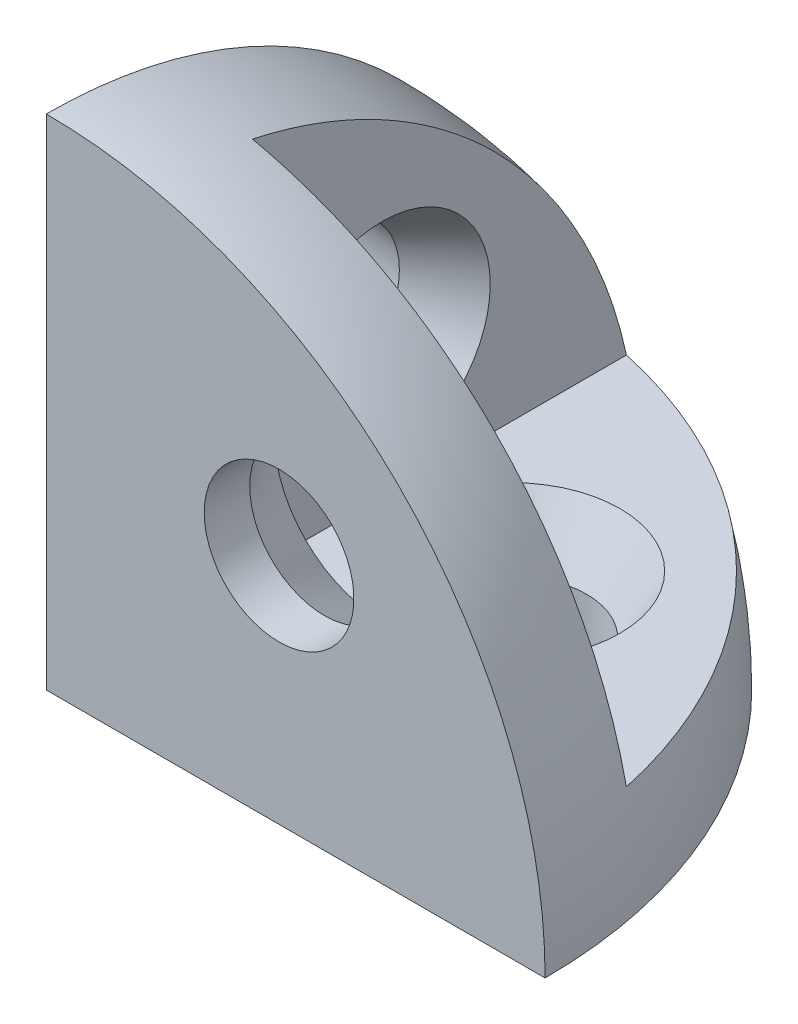
ISO-10303-21;
HEADER;
FILE_DESCRIPTION(('STEP AP214'),'2;1');
FILE_NAME('part.step','',(''),(''),'','','');
FILE_SCHEMA(('AUTOMOTIVE_DESIGN { 1 0 10303 214 1 1 1 1 }'));
ENDSEC;
DATA;
#1=APPLICATION_CONTEXT('core data for automotive mechanical design processes');
#2=APPLICATION_PROTOCOL_DEFINITION('international standard','automotive_design',2000,#1);
#3=PRODUCT_CONTEXT('',#1,'mechanical');
#4=PRODUCT('Part','Part','',(#3));
#5=PRODUCT_RELATED_PRODUCT_CATEGORY('part','',(#4));
#6=PRODUCT_DEFINITION_FORMATION('','',#4);
#7=PRODUCT_DEFINITION_CONTEXT('part definition',#1,'design');
#8=PRODUCT_DEFINITION('design','',#6,#7);
#9=PRODUCT_DEFINITION_SHAPE('','',#8);
#10=(LENGTH_UNIT() NAMED_UNIT(*) SI_UNIT(.MILLI.,.METRE.));
#11=(NAMED_UNIT(*) PLANE_ANGLE_UNIT() SI_UNIT($,.RADIAN.));
#12=(NAMED_UNIT(*) SI_UNIT($,.STERADIAN.) SOLID_ANGLE_UNIT());
#13=UNCERTAINTY_MEASURE_WITH_UNIT(LENGTH_MEASURE(1.E-05),#10,'distance_accuracy_value','');
#14=(GEOMETRIC_REPRESENTATION_CONTEXT(3) GLOBAL_UNCERTAINTY_ASSIGNED_CONTEXT((#13)) GLOBAL_UNIT_ASSIGNED_CONTEXT((#10,
#11,#12)) REPRESENTATION_CONTEXT('',''));
#15=CARTESIAN_POINT('',(0.,0.,0.));
#16=DIRECTION('',(0.,0.,1.));
#17=DIRECTION('',(1.,0.,0.));
#18=AXIS2_PLACEMENT_3D('',#15,#16,#17);
#19=CARTESIAN_POINT('',(-1.04744440165294E-13,0.,-30.));
#20=DIRECTION('',(0.,-1.,0.));
#21=DIRECTION('',(1.,0.,0.));
#22=AXIS2_PLACEMENT_3D('',#19,#20,#21);
#23=PLANE('',#22);
#24=CARTESIAN_POINT('',(14.,0.,-14.));
#25=DIRECTION('',(0.,1.,0.));
#26=DIRECTION('',(-1.,0.,0.));
#27=AXIS2_PLACEMENT_3D('',#24,#25,#26);
#28=CIRCLE('',#27,4.5);
#29=CARTESIAN_POINT('',(9.5,0.,-14.));
#30=VERTEX_POINT('',#29);
#31=EDGE_CURVE('E83',#30,#30,#28,.T.);
#32=ORIENTED_EDGE('',*,*,#31,.T.);
#33=EDGE_LOOP('',(#32));
#34=FACE_BOUND('',#33,.T.);
#35=CARTESIAN_POINT('',(0.,0.,0.));
#36=DIRECTION('',(0.,-1.,0.));
#37=DIRECTION('',(1.,0.,0.));
#38=AXIS2_PLACEMENT_3D('',#35,#36,#37);
#39=CIRCLE('',#38,30.);
#40=CARTESIAN_POINT('',(-1.04744440165294E-13,0.,-30.));
#41=VERTEX_POINT('',#40);
#42=CARTESIAN_POINT('',(30.,0.,0.));
#43=VERTEX_POINT('',#42);
#44=EDGE_CURVE('E111',#41,#43,#39,.T.);
#45=ORIENTED_EDGE('',*,*,#44,.T.);
#46=DIRECTION('',(1.,0.,0.));
#47=VECTOR('',#46,1.);
#48=CARTESIAN_POINT('',(30.,0.,0.));
#49=LINE('',#48,#47);
#50=CARTESIAN_POINT('',(0.,0.,0.));
#51=VERTEX_POINT('',#50);
#52=EDGE_CURVE('E98',#51,#43,#49,.T.);
#53=ORIENTED_EDGE('',*,*,#52,.F.);
#54=DIRECTION('',(0.,0.,-1.));
#55=VECTOR('',#54,1.);
#56=CARTESIAN_POINT('',(-1.04744440165294E-13,0.,-30.));
#57=LINE('',#56,#55);
#58=EDGE_CURVE('E105',#51,#41,#57,.T.);
#59=ORIENTED_EDGE('',*,*,#58,.T.);
#60=EDGE_LOOP('',(#45,#53,#59));
#61=FACE_BOUND('',#60,.T.);
#62=ADVANCED_FACE('F35',(#34,#61),#23,.T.);
#63=CARTESIAN_POINT('',(0.,0.,0.));
#64=DIRECTION('',(0.,-1.,0.));
#65=DIRECTION('',(0.,0.,-1.));
#66=AXIS2_PLACEMENT_3D('',#63,#64,#65);
#67=SPHERICAL_SURFACE('',#66,30.);
#68=CARTESIAN_POINT('',(6.2,0.,0.));
#69=DIRECTION('',(1.,0.,0.));
#70=DIRECTION('',(0.,0.,-1.));
#71=AXIS2_PLACEMENT_3D('',#68,#69,#70);
#72=CIRCLE('',#71,29.3523423256135);
#73=CARTESIAN_POINT('',(6.1999999999999,6.2,-28.6900679678526));
#74=VERTEX_POINT('',#73);
#75=CARTESIAN_POINT('',(6.19999999999998,28.6900679678526,-6.2));
#76=VERTEX_POINT('',#75);
#77=EDGE_CURVE('E90',#74,#76,#72,.T.);
#78=ORIENTED_EDGE('',*,*,#77,.F.);
#79=CARTESIAN_POINT('',(0.,6.2,0.));
#80=DIRECTION('',(0.,-1.,0.));
#81=DIRECTION('',(1.,0.,0.));
#82=AXIS2_PLACEMENT_3D('',#79,#80,#81);
#83=CIRCLE('',#82,29.3523423256135);
#84=CARTESIAN_POINT('',(28.6900679678526,6.2,-6.2));
#85=VERTEX_POINT('',#84);
#86=EDGE_CURVE('E93',#74,#85,#83,.T.);
#87=ORIENTED_EDGE('',*,*,#86,.T.);
#88=CARTESIAN_POINT('',(0.,0.,-6.2));
#89=DIRECTION('',(0.,0.,1.));
#90=DIRECTION('',(1.,0.,0.));
#91=AXIS2_PLACEMENT_3D('',#88,#89,#90);
#92=CIRCLE('',#91,29.3523423256135);
#93=EDGE_CURVE('E50',#85,#76,#92,.T.);
#94=ORIENTED_EDGE('',*,*,#93,.T.);
#95=EDGE_LOOP('',(#78,#87,#94));
#96=FACE_BOUND('',#95,.T.);
#97=CARTESIAN_POINT('',(0.,0.,0.));
#98=DIRECTION('',(1.,0.,0.));
#99=DIRECTION('',(0.,0.,-1.));
#100=AXIS2_PLACEMENT_3D('',#97,#98,#99);
#101=CIRCLE('',#100,30.);
#102=CARTESIAN_POINT('',(0.,30.,0.));
#103=VERTEX_POINT('',#102);
#104=EDGE_CURVE('E108',#41,#103,#101,.T.);
#105=ORIENTED_EDGE('',*,*,#104,.T.);
#106=CARTESIAN_POINT('',(0.,0.,0.));
#107=DIRECTION('',(0.,0.,1.));
#108=DIRECTION('',(1.,0.,0.));
#109=AXIS2_PLACEMENT_3D('',#106,#107,#108);
#110=CIRCLE('',#109,30.);
#111=EDGE_CURVE('E58',#43,#103,#110,.T.);
#112=ORIENTED_EDGE('',*,*,#111,.F.);
#113=ORIENTED_EDGE('',*,*,#44,.F.);
#114=EDGE_LOOP('',(#105,#112,#113));
#115=FACE_BOUND('',#114,.T.);
#116=ADVANCED_FACE('F140',(#96,#115),#67,.T.);
#117=CARTESIAN_POINT('',(0.,0.,0.));
#118=DIRECTION('',(1.,0.,0.));
#119=DIRECTION('',(0.,0.,-1.));
#120=AXIS2_PLACEMENT_3D('',#117,#118,#119);
#121=PLANE('',#120);
#122=CARTESIAN_POINT('',(-1.55257751099924E-13,14.,-14.));
#123=DIRECTION('',(1.,0.,0.));
#124=DIRECTION('',(0.,0.,-1.));
#125=AXIS2_PLACEMENT_3D('',#122,#123,#124);
#126=CIRCLE('',#125,4.5);
#127=CARTESIAN_POINT('',(-1.70969417124718E-13,14.,-18.5));
#128=VERTEX_POINT('',#127);
#129=EDGE_CURVE('E168',#128,#128,#126,.T.);
#130=ORIENTED_EDGE('',*,*,#129,.T.);
#131=EDGE_LOOP('',(#130));
#132=FACE_BOUND('',#131,.T.);
#133=DIRECTION('',(0.,-1.,0.));
#134=VECTOR('',#133,1.);
#135=CARTESIAN_POINT('',(0.,0.,0.));
#136=LINE('',#135,#134);
#137=EDGE_CURVE('E103',#103,#51,#136,.T.);
#138=ORIENTED_EDGE('',*,*,#137,.F.);
#139=ORIENTED_EDGE('',*,*,#104,.F.);
#140=ORIENTED_EDGE('',*,*,#58,.F.);
#141=EDGE_LOOP('',(#138,#139,#140));
#142=FACE_BOUND('',#141,.T.);
#143=ADVANCED_FACE('F147',(#132,#142),#121,.F.);
#144=CARTESIAN_POINT('',(0.,0.,0.));
#145=DIRECTION('',(0.,0.,1.));
#146=DIRECTION('',(1.,0.,0.));
#147=AXIS2_PLACEMENT_3D('',#144,#145,#146);
#148=PLANE('',#147);
#149=CARTESIAN_POINT('',(14.,14.,0.));
#150=DIRECTION('',(0.,0.,-1.));
#151=DIRECTION('',(-1.,0.,0.));
#152=AXIS2_PLACEMENT_3D('',#149,#150,#151);
#153=CIRCLE('',#152,4.5);
#154=CARTESIAN_POINT('',(9.5,14.,0.));
#155=VERTEX_POINT('',#154);
#156=EDGE_CURVE('E170',#155,#155,#153,.T.);
#157=ORIENTED_EDGE('',*,*,#156,.T.);
#158=EDGE_LOOP('',(#157));
#159=FACE_BOUND('',#158,.T.);
#160=ORIENTED_EDGE('',*,*,#137,.T.);
#161=ORIENTED_EDGE('',*,*,#52,.T.);
#162=ORIENTED_EDGE('',*,*,#111,.T.);
#163=EDGE_LOOP('',(#160,#161,#162));
#164=FACE_BOUND('',#163,.T.);
#165=ADVANCED_FACE('F191',(#159,#164),#148,.T.);
#166=CARTESIAN_POINT('',(-1.04364799657558E-13,6.2,-30.));
#167=DIRECTION('',(0.,-1.,0.));
#168=DIRECTION('',(1.,0.,0.));
#169=AXIS2_PLACEMENT_3D('',#166,#167,#168);
#170=PLANE('',#169);
#171=CARTESIAN_POINT('',(14.,6.2,-14.));
#172=DIRECTION('',(0.,-1.,0.));
#173=DIRECTION('',(1.,0.,0.));
#174=AXIS2_PLACEMENT_3D('',#171,#172,#173);
#175=CIRCLE('',#174,6.50000000000001);
#176=CARTESIAN_POINT('',(20.5,6.2,-14.));
#177=VERTEX_POINT('',#176);
#178=EDGE_CURVE('E122',#177,#177,#175,.T.);
#179=ORIENTED_EDGE('',*,*,#178,.T.);
#180=EDGE_LOOP('',(#179));
#181=FACE_BOUND('',#180,.T.);
#182=ORIENTED_EDGE('',*,*,#86,.F.);
#183=DIRECTION('',(0.,0.,-1.));
#184=VECTOR('',#183,1.);
#185=CARTESIAN_POINT('',(6.2,6.2,0.));
#186=LINE('',#185,#184);
#187=CARTESIAN_POINT('',(6.19999999999998,6.2,-6.2));
#188=VERTEX_POINT('',#187);
#189=EDGE_CURVE('E88',#188,#74,#186,.T.);
#190=ORIENTED_EDGE('',*,*,#189,.F.);
#191=DIRECTION('',(1.,0.,0.));
#192=VECTOR('',#191,1.);
#193=CARTESIAN_POINT('',(0.,6.2,-6.2));
#194=LINE('',#193,#192);
#195=EDGE_CURVE('E75',#188,#85,#194,.T.);
#196=ORIENTED_EDGE('',*,*,#195,.T.);
#197=EDGE_LOOP('',(#182,#190,#196));
#198=FACE_BOUND('',#197,.T.);
#199=ADVANCED_FACE('F92',(#181,#198),#170,.F.);
#200=CARTESIAN_POINT('',(6.2,0.,0.));
#201=DIRECTION('',(1.,0.,0.));
#202=DIRECTION('',(0.,0.,-1.));
#203=AXIS2_PLACEMENT_3D('',#200,#201,#202);
#204=PLANE('',#203);
#205=CARTESIAN_POINT('',(6.19999999999995,14.,-14.));
#206=DIRECTION('',(1.,0.,0.));
#207=DIRECTION('',(0.,0.,-1.));
#208=AXIS2_PLACEMENT_3D('',#205,#206,#207);
#209=CIRCLE('',#208,6.50000000000002);
#210=CARTESIAN_POINT('',(6.19999999999993,14.,-20.5));
#211=VERTEX_POINT('',#210);
#212=EDGE_CURVE('E116',#211,#211,#209,.F.);
#213=ORIENTED_EDGE('',*,*,#212,.T.);
#214=EDGE_LOOP('',(#213));
#215=FACE_BOUND('',#214,.T.);
#216=DIRECTION('',(0.,-1.,0.));
#217=VECTOR('',#216,1.);
#218=CARTESIAN_POINT('',(6.19999999999998,0.,-6.2));
#219=LINE('',#218,#217);
#220=EDGE_CURVE('E78',#76,#188,#219,.T.);
#221=ORIENTED_EDGE('',*,*,#220,.T.);
#222=ORIENTED_EDGE('',*,*,#189,.T.);
#223=ORIENTED_EDGE('',*,*,#77,.T.);
#224=EDGE_LOOP('',(#221,#222,#223));
#225=FACE_BOUND('',#224,.T.);
#226=ADVANCED_FACE('F87',(#215,#225),#204,.T.);
#227=CARTESIAN_POINT('',(0.,0.,-6.2));
#228=DIRECTION('',(0.,0.,1.));
#229=DIRECTION('',(1.,0.,0.));
#230=AXIS2_PLACEMENT_3D('',#227,#228,#229);
#231=PLANE('',#230);
#232=CARTESIAN_POINT('',(14.,14.,-6.2));
#233=DIRECTION('',(0.,0.,1.));
#234=DIRECTION('',(1.,0.,0.));
#235=AXIS2_PLACEMENT_3D('',#232,#233,#234);
#236=CIRCLE('',#235,6.50000000000004);
#237=CARTESIAN_POINT('',(7.49999999999996,14.,-6.2));
#238=VERTEX_POINT('',#237);
#239=EDGE_CURVE('E11',#238,#238,#236,.T.);
#240=ORIENTED_EDGE('',*,*,#239,.T.);
#241=EDGE_LOOP('',(#240));
#242=FACE_BOUND('',#241,.T.);
#243=ORIENTED_EDGE('',*,*,#220,.F.);
#244=ORIENTED_EDGE('',*,*,#93,.F.);
#245=ORIENTED_EDGE('',*,*,#195,.F.);
#246=EDGE_LOOP('',(#243,#244,#245));
#247=FACE_BOUND('',#246,.T.);
#248=ADVANCED_FACE('F77',(#242,#247),#231,.F.);
#249=CARTESIAN_POINT('',(14.,0.,-14.));
#250=DIRECTION('',(0.,1.,0.));
#251=DIRECTION('',(-1.,0.,0.));
#252=AXIS2_PLACEMENT_3D('',#249,#250,#251);
#253=CYLINDRICAL_SURFACE('',#252,4.5);
#254=CARTESIAN_POINT('',(14.,2.73589838486224,-14.));
#255=DIRECTION('',(0.,-1.,0.));
#256=DIRECTION('',(0.,0.,-1.));
#257=AXIS2_PLACEMENT_3D('',#254,#255,#256);
#258=CIRCLE('',#257,4.5);
#259=CARTESIAN_POINT('',(14.,2.73589838486224,-18.5));
#260=VERTEX_POINT('',#259);
#261=EDGE_CURVE('E119',#260,#260,#258,.F.);
#262=ORIENTED_EDGE('',*,*,#261,.T.);
#263=EDGE_LOOP('',(#262));
#264=FACE_BOUND('',#263,.T.);
#265=ORIENTED_EDGE('',*,*,#31,.F.);
#266=EDGE_LOOP('',(#265));
#267=FACE_BOUND('',#266,.T.);
#268=ADVANCED_FACE('F176',(#264,#267),#253,.F.);
#269=CARTESIAN_POINT('',(14.,14.,0.));
#270=DIRECTION('',(0.,0.,-1.));
#271=DIRECTION('',(-1.,0.,0.));
#272=AXIS2_PLACEMENT_3D('',#269,#270,#271);
#273=CYLINDRICAL_SURFACE('',#272,4.5);
#274=CARTESIAN_POINT('',(14.,14.,-2.73589838486217));
#275=DIRECTION('',(0.,0.,1.));
#276=DIRECTION('',(1.,0.,0.));
#277=AXIS2_PLACEMENT_3D('',#274,#275,#276);
#278=CIRCLE('',#277,4.5);
#279=CARTESIAN_POINT('',(9.5,14.,-2.73589838486217));
#280=VERTEX_POINT('',#279);
#281=EDGE_CURVE('E43',#280,#280,#278,.F.);
#282=CARTESIAN_POINT('',(9.5,14.,-2.73589838486217));
#283=CARTESIAN_POINT('',(9.5,14.,-2.70739944335319));
#284=CARTESIAN_POINT('',(9.5,14.,-2.67890050184421));
#285=CARTESIAN_POINT('',(9.5,14.,-2.62190261882625));
#286=CARTESIAN_POINT('',(9.5,14.,-2.59340367731727));
#287=CARTESIAN_POINT('',(9.5,14.,-2.53640579429931));
#288=CARTESIAN_POINT('',(9.5,14.,-2.50790685279033));
#289=CARTESIAN_POINT('',(9.5,14.,-2.45090896977236));
#290=CARTESIAN_POINT('',(9.5,14.,-2.42241002826338));
#291=CARTESIAN_POINT('',(9.5,14.,-2.36541214524542));
#292=CARTESIAN_POINT('',(9.5,14.,-2.33691320373644));
#293=CARTESIAN_POINT('',(9.5,14.,-2.27991532071848));
#294=CARTESIAN_POINT('',(9.5,14.,-2.2514163792095));
#295=CARTESIAN_POINT('',(9.5,14.,-2.19441849619154));
#296=CARTESIAN_POINT('',(9.5,14.,-2.16591955468255));
#297=CARTESIAN_POINT('',(9.5,14.,-2.10892167166459));
#298=CARTESIAN_POINT('',(9.5,14.,-2.08042273015561));
#299=CARTESIAN_POINT('',(9.5,14.,-2.02342484713765));
#300=CARTESIAN_POINT('',(9.5,14.,-1.99492590562867));
#301=CARTESIAN_POINT('',(9.5,14.,-1.93792802261071));
#302=CARTESIAN_POINT('',(9.5,14.,-1.90942908110173));
#303=CARTESIAN_POINT('',(9.5,14.,-1.85243119808376));
#304=CARTESIAN_POINT('',(9.5,14.,-1.82393225657478));
#305=CARTESIAN_POINT('',(9.5,14.,-1.76693437355682));
#306=CARTESIAN_POINT('',(9.5,14.,-1.73843543204784));
#307=CARTESIAN_POINT('',(9.5,14.,-1.68143754902988));
#308=CARTESIAN_POINT('',(9.5,14.,-1.6529386075209));
#309=CARTESIAN_POINT('',(9.5,14.,-1.59594072450293));
#310=CARTESIAN_POINT('',(9.5,14.,-1.56744178299395));
#311=CARTESIAN_POINT('',(9.5,14.,-1.51044389997599));
#312=CARTESIAN_POINT('',(9.5,14.,-1.48194495846701));
#313=CARTESIAN_POINT('',(9.5,14.,-1.42494707544905));
#314=CARTESIAN_POINT('',(9.5,14.,-1.39644813394007));
#315=CARTESIAN_POINT('',(9.5,14.,-1.33945025092211));
#316=CARTESIAN_POINT('',(9.5,14.,-1.31095130941313));
#317=CARTESIAN_POINT('',(9.5,14.,-1.25395342639516));
#318=CARTESIAN_POINT('',(9.5,14.,-1.22545448488618));
#319=CARTESIAN_POINT('',(9.5,14.,-1.16845660186822));
#320=CARTESIAN_POINT('',(9.5,14.,-1.13995766035924));
#321=CARTESIAN_POINT('',(9.5,14.,-1.08295977734128));
#322=CARTESIAN_POINT('',(9.5,14.,-1.0544608358323));
#323=CARTESIAN_POINT('',(9.5,14.,-0.997462952814335));
#324=CARTESIAN_POINT('',(9.5,14.,-0.968964011305353));
#325=CARTESIAN_POINT('',(9.5,14.,-0.911966128287392));
#326=CARTESIAN_POINT('',(9.5,14.,-0.88346718677841));
#327=CARTESIAN_POINT('',(9.5,14.,-0.826469303760448));
#328=CARTESIAN_POINT('',(9.5,14.,-0.797970362251468));
#329=CARTESIAN_POINT('',(9.5,14.,-0.740972479233506));
#330=CARTESIAN_POINT('',(9.5,14.,-0.712473537724524));
#331=CARTESIAN_POINT('',(9.5,14.,-0.655475654706562));
#332=CARTESIAN_POINT('',(9.5,14.,-0.626976713197582));
#333=CARTESIAN_POINT('',(9.5,14.,-0.56997883017962));
#334=CARTESIAN_POINT('',(9.5,14.,-0.541479888670639));
#335=CARTESIAN_POINT('',(9.5,14.,-0.484482005652677));
#336=CARTESIAN_POINT('',(9.5,14.,-0.455983064143696));
#337=CARTESIAN_POINT('',(9.5,14.,-0.398985181125734));
#338=CARTESIAN_POINT('',(9.5,14.,-0.370486239616753));
#339=CARTESIAN_POINT('',(9.5,14.,-0.313488356598791));
#340=CARTESIAN_POINT('',(9.5,14.,-0.28498941508981));
#341=CARTESIAN_POINT('',(9.5,14.,-0.227991532071848));
#342=CARTESIAN_POINT('',(9.5,14.,-0.199492590562867));
#343=CARTESIAN_POINT('',(9.5,14.,-0.142494707544905));
#344=CARTESIAN_POINT('',(9.5,14.,-0.113995766035924));
#345=CARTESIAN_POINT('',(9.5,14.,-0.0569978830179619));
#346=CARTESIAN_POINT('',(9.5,14.,-0.028498941508981));
#347=CARTESIAN_POINT('',(9.5,14.,0.));
#348=B_SPLINE_CURVE_WITH_KNOTS('',3,(#282,#283,#284,#285,#286,#287,#288,#289,#290,#291,#292,
#293,#294,#295,#296,#297,#298,#299,#300,#301,#302,#303,#304,#305,#306,#307,#308,#309,#310,#311,
#312,#313,#314,#315,#316,#317,#318,#319,#320,#321,#322,#323,#324,#325,#326,#327,#328,#329,#330,
#331,#332,#333,#334,#335,#336,#337,#338,#339,#340,#341,#342,#343,#344,#345,#346,#347),
.UNSPECIFIED.,.F.,.F.,(4,2,2,2,2,2,2,2,2,2,2,2,2,2,2,2,2,2,2,2,2,2,2,2,2,2,2,2,2,2,2,2,4),(0.,
0.0854968245269428,0.170993649053886,0.256490473580829,0.341987298107772,0.427484122634715,
0.512980947161658,0.598477771688601,0.683974596215543,0.769471420742487,0.854968245269429,
0.940465069796372,1.02596189432332,1.11145871885026,1.1969555433772,1.28245236790414,
1.36794919243109,1.45344601695803,1.53894284148497,1.62443966601192,1.70993649053886,
1.7954333150658,1.88093013959274,1.96642696411969,2.05192378864663,2.13742061317357,
2.22291743770052,2.30841426222746,2.3939110867544,2.47940791128135,2.56490473580829,
2.65040156033523,2.73589838486217),.UNSPECIFIED.);
#349=EDGE_CURVE('BSEAM127',#280,#155,#348,.T.);
#350=ORIENTED_EDGE('',*,*,#281,.T.);
#351=ORIENTED_EDGE('',*,*,#156,.F.);
#352=ORIENTED_EDGE('',*,*,#349,.T.);
#353=ORIENTED_EDGE('',*,*,#349,.F.);
#354=EDGE_LOOP('',(#350,#352,#351,#353));
#355=FACE_BOUND('',#354,.T.);
#356=ADVANCED_FACE('F127',(#355),#273,.F.);
#357=CARTESIAN_POINT('',(-1.55257751099924E-13,14.,-14.));
#358=DIRECTION('',(1.,0.,0.));
#359=DIRECTION('',(0.,0.,-1.));
#360=AXIS2_PLACEMENT_3D('',#357,#358,#359);
#361=CYLINDRICAL_SURFACE('',#360,4.5);
#362=CARTESIAN_POINT('',(2.73589838486217,14.,-14.));
#363=DIRECTION('',(1.,0.,0.));
#364=DIRECTION('',(0.,0.,-1.));
#365=AXIS2_PLACEMENT_3D('',#362,#363,#364);
#366=CIRCLE('',#365,4.5);
#367=CARTESIAN_POINT('',(2.73589838486216,14.,-18.5));
#368=VERTEX_POINT('',#367);
#369=EDGE_CURVE('E113',#368,#368,#366,.T.);
#370=ORIENTED_EDGE('',*,*,#369,.T.);
#371=EDGE_LOOP('',(#370));
#372=FACE_BOUND('',#371,.T.);
#373=ORIENTED_EDGE('',*,*,#129,.F.);
#374=EDGE_LOOP('',(#373));
#375=FACE_BOUND('',#374,.T.);
#376=ADVANCED_FACE('F155',(#372,#375),#361,.F.);
#377=CARTESIAN_POINT('',(2.73589838486218,14.,-14.));
#378=DIRECTION('',(1.,0.,0.));
#379=DIRECTION('',(0.,0.,-1.));
#380=AXIS2_PLACEMENT_3D('',#377,#378,#379);
#381=CONICAL_SURFACE('',#380,4.5,0.5235987755983);
#382=ORIENTED_EDGE('',*,*,#212,.F.);
#383=EDGE_LOOP('',(#382));
#384=FACE_BOUND('',#383,.T.);
#385=ORIENTED_EDGE('',*,*,#369,.F.);
#386=EDGE_LOOP('',(#385));
#387=FACE_BOUND('',#386,.T.);
#388=ADVANCED_FACE('F136',(#384,#387),#381,.F.);
#389=CARTESIAN_POINT('',(14.,2.73589838486224,-14.));
#390=DIRECTION('',(0.,1.,0.));
#391=DIRECTION('',(0.,0.,1.));
#392=AXIS2_PLACEMENT_3D('',#389,#390,#391);
#393=CONICAL_SURFACE('',#392,4.5,0.523598775598299);
#394=ORIENTED_EDGE('',*,*,#178,.F.);
#395=EDGE_LOOP('',(#394));
#396=FACE_BOUND('',#395,.T.);
#397=ORIENTED_EDGE('',*,*,#261,.F.);
#398=EDGE_LOOP('',(#397));
#399=FACE_BOUND('',#398,.T.);
#400=ADVANCED_FACE('F131',(#396,#399),#393,.F.);
#401=CARTESIAN_POINT('',(14.,14.,-2.73589838486217));
#402=DIRECTION('',(0.,0.,-1.));
#403=DIRECTION('',(-1.,0.,0.));
#404=AXIS2_PLACEMENT_3D('',#401,#402,#403);
#405=CONICAL_SURFACE('',#404,4.5,0.523598775598299);
#406=CARTESIAN_POINT('',(7.49999999999996,14.,-6.2));
#407=CARTESIAN_POINT('',(7.52083333333329,14.,-6.16391560817565));
#408=CARTESIAN_POINT('',(7.54166666666663,14.,-6.1278312163513));
#409=CARTESIAN_POINT('',(7.58333333333329,14.,-6.05566243270259));
#410=CARTESIAN_POINT('',(7.60416666666663,14.,-6.01957804087824));
#411=CARTESIAN_POINT('',(7.64583333333329,14.,-5.94740925722953));
#412=CARTESIAN_POINT('',(7.66666666666663,14.,-5.91132486540518));
#413=CARTESIAN_POINT('',(7.7083333333333,14.,-5.83915608175648));
#414=CARTESIAN_POINT('',(7.72916666666663,14.,-5.80307168993212));
#415=CARTESIAN_POINT('',(7.7708333333333,14.,-5.73090290628342));
#416=CARTESIAN_POINT('',(7.79166666666663,14.,-5.69481851445907));
#417=CARTESIAN_POINT('',(7.8333333333333,14.,-5.62264973081036));
#418=CARTESIAN_POINT('',(7.85416666666663,14.,-5.58656533898601));
#419=CARTESIAN_POINT('',(7.8958333333333,14.,-5.51439655533731));
#420=CARTESIAN_POINT('',(7.91666666666663,14.,-5.47831216351295));
#421=CARTESIAN_POINT('',(7.9583333333333,14.,-5.40614337986425));
#422=CARTESIAN_POINT('',(7.97916666666663,14.,-5.3700589880399));
#423=CARTESIAN_POINT('',(8.0208333333333,14.,-5.29789020439119));
#424=CARTESIAN_POINT('',(8.04166666666664,14.,-5.26180581256684));
#425=CARTESIAN_POINT('',(8.0833333333333,14.,-5.18963702891813));
#426=CARTESIAN_POINT('',(8.10416666666664,14.,-5.15355263709378));
#427=CARTESIAN_POINT('',(8.14583333333331,14.,-5.08138385344508));
#428=CARTESIAN_POINT('',(8.16666666666664,14.,-5.04529946162072));
#429=CARTESIAN_POINT('',(8.20833333333331,14.,-4.97313067797202));
#430=CARTESIAN_POINT('',(8.22916666666664,14.,-4.93704628614767));
#431=CARTESIAN_POINT('',(8.27083333333331,14.,-4.86487750249896));
#432=CARTESIAN_POINT('',(8.29166666666664,14.,-4.82879311067461));
#433=CARTESIAN_POINT('',(8.33333333333331,14.,-4.75662432702591));
#434=CARTESIAN_POINT('',(8.35416666666664,14.,-4.72053993520155));
#435=CARTESIAN_POINT('',(8.39583333333331,14.,-4.64837115155285));
#436=CARTESIAN_POINT('',(8.41666666666664,14.,-4.6122867597285));
#437=CARTESIAN_POINT('',(8.45833333333331,14.,-4.54011797607979));
#438=CARTESIAN_POINT('',(8.47916666666664,14.,-4.50403358425544));
#439=CARTESIAN_POINT('',(8.52083333333331,14.,-4.43186480060674));
#440=CARTESIAN_POINT('',(8.54166666666665,14.,-4.39578040878238));
#441=CARTESIAN_POINT('',(8.58333333333331,14.,-4.32361162513368));
#442=CARTESIAN_POINT('',(8.60416666666665,14.,-4.28752723330933));
#443=CARTESIAN_POINT('',(8.64583333333332,14.,-4.21535844966062));
#444=CARTESIAN_POINT('',(8.66666666666665,14.,-4.17927405783627));
#445=CARTESIAN_POINT('',(8.70833333333332,14.,-4.10710527418756));
#446=CARTESIAN_POINT('',(8.72916666666665,14.,-4.07102088236321));
#447=CARTESIAN_POINT('',(8.77083333333332,14.,-3.99885209871451));
#448=CARTESIAN_POINT('',(8.79166666666665,14.,-3.96276770689015));
#449=CARTESIAN_POINT('',(8.83333333333332,14.,-3.89059892324145));
#450=CARTESIAN_POINT('',(8.85416666666665,14.,-3.8545145314171));
#451=CARTESIAN_POINT('',(8.89583333333332,14.,-3.78234574776839));
#452=CARTESIAN_POINT('',(8.91666666666665,14.,-3.74626135594404));
#453=CARTESIAN_POINT('',(8.95833333333332,14.,-3.67409257229534));
#454=CARTESIAN_POINT('',(8.97916666666666,14.,-3.63800818047098));
#455=CARTESIAN_POINT('',(9.02083333333332,14.,-3.56583939682228));
#456=CARTESIAN_POINT('',(9.04166666666666,14.,-3.52975500499793));
#457=CARTESIAN_POINT('',(9.08333333333332,14.,-3.45758622134922));
#458=CARTESIAN_POINT('',(9.10416666666666,14.,-3.42150182952487));
#459=CARTESIAN_POINT('',(9.14583333333333,14.,-3.34933304587616));
#460=CARTESIAN_POINT('',(9.16666666666666,14.,-3.31324865405181));
#461=CARTESIAN_POINT('',(9.20833333333333,14.,-3.24107987040311));
#462=CARTESIAN_POINT('',(9.22916666666666,14.,-3.20499547857875));
#463=CARTESIAN_POINT('',(9.27083333333333,14.,-3.13282669493005));
#464=CARTESIAN_POINT('',(9.29166666666666,14.,-3.0967423031057));
#465=CARTESIAN_POINT('',(9.33333333333333,14.,-3.02457351945699));
#466=CARTESIAN_POINT('',(9.35416666666666,14.,-2.98848912763264));
#467=CARTESIAN_POINT('',(9.39583333333333,14.,-2.91632034398394));
#468=CARTESIAN_POINT('',(9.41666666666667,14.,-2.88023595215958));
#469=CARTESIAN_POINT('',(9.45833333333333,14.,-2.80806716851088));
#470=CARTESIAN_POINT('',(9.47916666666667,14.,-2.77198277668653));
#471=CARTESIAN_POINT('',(9.5,14.,-2.73589838486217));
#472=B_SPLINE_CURVE_WITH_KNOTS('',3,(#406,#407,#408,#409,#410,#411,#412,#413,#414,#415,#416,
#417,#418,#419,#420,#421,#422,#423,#424,#425,#426,#427,#428,#429,#430,#431,#432,#433,#434,#435,
#436,#437,#438,#439,#440,#441,#442,#443,#444,#445,#446,#447,#448,#449,#450,#451,#452,#453,#454,
#455,#456,#457,#458,#459,#460,#461,#462,#463,#464,#465,#466,#467,#468,#469,#470,#471),
.UNSPECIFIED.,.F.,.F.,(4,2,2,2,2,2,2,2,2,2,2,2,2,2,2,2,2,2,2,2,2,2,2,2,2,2,2,2,2,2,2,2,4),(0.,
0.125000000000002,0.250000000000005,0.375000000000008,0.500000000000011,0.625000000000013,
0.750000000000015,0.875000000000018,1.00000000000002,1.12500000000002,1.25000000000003,
1.37500000000003,1.50000000000003,1.62500000000003,1.75000000000004,1.87500000000004,
2.00000000000004,2.12500000000004,2.25000000000005,2.37500000000005,2.50000000000005,
2.62500000000006,2.75000000000006,2.87500000000006,3.00000000000006,3.12500000000006,
3.25000000000007,3.37500000000007,3.50000000000007,3.62500000000007,3.75000000000008,
3.87500000000008,4.00000000000008),.UNSPECIFIED.);
#473=EDGE_CURVE('BSEAM37',#238,#280,#472,.T.);
#474=ORIENTED_EDGE('',*,*,#239,.F.);
#475=ORIENTED_EDGE('',*,*,#281,.F.);
#476=ORIENTED_EDGE('',*,*,#473,.T.);
#477=ORIENTED_EDGE('',*,*,#473,.F.);
#478=EDGE_LOOP('',(#474,#476,#475,#477));
#479=FACE_BOUND('',#478,.T.);
#480=ADVANCED_FACE('F37',(#479),#405,.F.);
#481=CLOSED_SHELL('',(#62,#116,#143,#165,#199,#226,#248,#268,#356,#376,#388,#400,#480));
#482=MANIFOLD_SOLID_BREP('B2',#481);
#483=ADVANCED_BREP_SHAPE_REPRESENTATION('',(#18,#482),#14);
#484=SHAPE_DEFINITION_REPRESENTATION(#9,#483);
ENDSEC;
END-ISO-10303-21;
